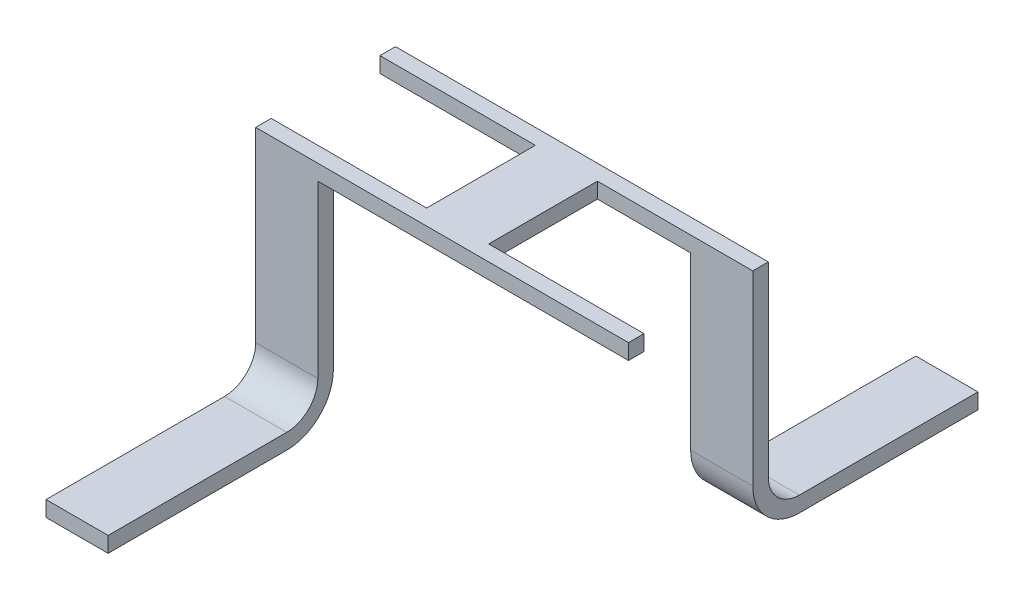
ISO-10303-21;
HEADER;
FILE_DESCRIPTION(('STEP AP214'),'2;1');
FILE_NAME('part.step','',(''),(''),'','','');
FILE_SCHEMA(('AUTOMOTIVE_DESIGN { 1 0 10303 214 1 1 1 1 }'));
ENDSEC;
DATA;
#1=APPLICATION_CONTEXT('core data for automotive mechanical design processes');
#2=APPLICATION_PROTOCOL_DEFINITION('international standard','automotive_design',2000,#1);
#3=PRODUCT_CONTEXT('',#1,'mechanical');
#4=PRODUCT('Part','Part','',(#3));
#5=PRODUCT_RELATED_PRODUCT_CATEGORY('part','',(#4));
#6=PRODUCT_DEFINITION_FORMATION('','',#4);
#7=PRODUCT_DEFINITION_CONTEXT('part definition',#1,'design');
#8=PRODUCT_DEFINITION('design','',#6,#7);
#9=PRODUCT_DEFINITION_SHAPE('','',#8);
#10=(LENGTH_UNIT() NAMED_UNIT(*) SI_UNIT(.MILLI.,.METRE.));
#11=(NAMED_UNIT(*) PLANE_ANGLE_UNIT() SI_UNIT($,.RADIAN.));
#12=(NAMED_UNIT(*) SI_UNIT($,.STERADIAN.) SOLID_ANGLE_UNIT());
#13=UNCERTAINTY_MEASURE_WITH_UNIT(LENGTH_MEASURE(1.E-05),#10,'distance_accuracy_value','');
#14=(GEOMETRIC_REPRESENTATION_CONTEXT(3) GLOBAL_UNCERTAINTY_ASSIGNED_CONTEXT((#13)) GLOBAL_UNIT_ASSIGNED_CONTEXT((#10,
#11,#12)) REPRESENTATION_CONTEXT('',''));
#15=CARTESIAN_POINT('',(0.,0.,0.));
#16=DIRECTION('',(0.,0.,1.));
#17=DIRECTION('',(1.,0.,0.));
#18=AXIS2_PLACEMENT_3D('',#15,#16,#17);
#19=CARTESIAN_POINT('',(1.524,1.778,-0.4445));
#20=DIRECTION('',(0.,0.,-1.));
#21=DIRECTION('',(-1.,0.,0.));
#22=AXIS2_PLACEMENT_3D('',#19,#20,#21);
#23=PLANE('',#22);
#24=DIRECTION('',(0.,-1.,0.));
#25=VECTOR('',#24,1.);
#26=CARTESIAN_POINT('',(-1.524,1.778,-0.4445));
#27=LINE('',#26,#25);
#28=CARTESIAN_POINT('',(-1.524,1.905,-0.4445));
#29=VERTEX_POINT('',#28);
#30=CARTESIAN_POINT('',(-1.524,1.778,-0.4445));
#31=VERTEX_POINT('',#30);
#32=EDGE_CURVE('E11',#29,#31,#27,.T.);
#33=ORIENTED_EDGE('',*,*,#32,.T.);
#34=DIRECTION('',(1.,0.,0.));
#35=VECTOR('',#34,1.);
#36=CARTESIAN_POINT('',(1.524,1.778,-0.4445));
#37=LINE('',#36,#35);
#38=CARTESIAN_POINT('',(-0.254,1.778,-0.4445));
#39=VERTEX_POINT('',#38);
#40=EDGE_CURVE('E25',#31,#39,#37,.T.);
#41=ORIENTED_EDGE('',*,*,#40,.T.);
#42=DIRECTION('',(0.,1.,0.));
#43=VECTOR('',#42,1.);
#44=CARTESIAN_POINT('',(-0.254,0.,-0.4445));
#45=LINE('',#44,#43);
#46=CARTESIAN_POINT('',(-0.254,1.905,-0.4445));
#47=VERTEX_POINT('',#46);
#48=EDGE_CURVE('E508',#39,#47,#45,.T.);
#49=ORIENTED_EDGE('',*,*,#48,.T.);
#50=DIRECTION('',(-1.,0.,0.));
#51=VECTOR('',#50,1.);
#52=CARTESIAN_POINT('',(1.524,1.905,-0.4445));
#53=LINE('',#52,#51);
#54=EDGE_CURVE('E504',#47,#29,#53,.T.);
#55=ORIENTED_EDGE('',*,*,#54,.T.);
#56=EDGE_LOOP('',(#33,#41,#49,#55));
#57=FACE_BOUND('',#56,.T.);
#58=ADVANCED_FACE('F17',(#57),#23,.F.);
#59=CARTESIAN_POINT('',(1.524,1.905,-0.5715));
#60=DIRECTION('',(0.,-1.,0.));
#61=DIRECTION('',(0.,0.,-1.));
#62=AXIS2_PLACEMENT_3D('',#59,#60,#61);
#63=PLANE('',#62);
#64=DIRECTION('',(0.,0.,1.));
#65=VECTOR('',#64,1.);
#66=CARTESIAN_POINT('',(1.524,1.905,-0.5715));
#67=LINE('',#66,#65);
#68=CARTESIAN_POINT('',(1.524,1.905,0.4445));
#69=VERTEX_POINT('',#68);
#70=CARTESIAN_POINT('',(1.524,1.905,0.5715));
#71=VERTEX_POINT('',#70);
#72=EDGE_CURVE('E499',#69,#71,#67,.T.);
#73=ORIENTED_EDGE('',*,*,#72,.F.);
#74=DIRECTION('',(-1.,0.,0.));
#75=VECTOR('',#74,1.);
#76=CARTESIAN_POINT('',(1.524,1.905,0.4445));
#77=LINE('',#76,#75);
#78=CARTESIAN_POINT('',(0.254,1.905,0.4445));
#79=VERTEX_POINT('',#78);
#80=EDGE_CURVE('E495',#69,#79,#77,.T.);
#81=ORIENTED_EDGE('',*,*,#80,.T.);
#82=DIRECTION('',(0.,0.,-1.));
#83=VECTOR('',#82,1.);
#84=CARTESIAN_POINT('',(0.254,1.905,0.4445));
#85=LINE('',#84,#83);
#86=CARTESIAN_POINT('',(0.254,1.905,-0.4445));
#87=VERTEX_POINT('',#86);
#88=EDGE_CURVE('E491',#79,#87,#85,.T.);
#89=ORIENTED_EDGE('',*,*,#88,.T.);
#90=DIRECTION('',(-1.,0.,0.));
#91=VECTOR('',#90,1.);
#92=CARTESIAN_POINT('',(1.524,1.905,-0.4445));
#93=LINE('',#92,#91);
#94=CARTESIAN_POINT('',(1.524,1.905,-0.4445));
#95=VERTEX_POINT('',#94);
#96=EDGE_CURVE('E486',#95,#87,#93,.T.);
#97=ORIENTED_EDGE('',*,*,#96,.F.);
#98=DIRECTION('',(0.,0.,1.));
#99=VECTOR('',#98,1.);
#100=CARTESIAN_POINT('',(1.524,1.905,-0.5715));
#101=LINE('',#100,#99);
#102=CARTESIAN_POINT('',(1.524,1.905,-0.5715));
#103=VERTEX_POINT('',#102);
#104=EDGE_CURVE('E481',#103,#95,#101,.T.);
#105=ORIENTED_EDGE('',*,*,#104,.F.);
#106=DIRECTION('',(-1.,0.,0.));
#107=VECTOR('',#106,1.);
#108=CARTESIAN_POINT('',(1.524,1.905,-0.5715));
#109=LINE('',#108,#107);
#110=CARTESIAN_POINT('',(-1.524,1.905,-0.5715));
#111=VERTEX_POINT('',#110);
#112=EDGE_CURVE('E477',#103,#111,#109,.T.);
#113=ORIENTED_EDGE('',*,*,#112,.T.);
#114=DIRECTION('',(0.,0.,1.));
#115=VECTOR('',#114,1.);
#116=CARTESIAN_POINT('',(-1.524,1.905,-0.5715));
#117=LINE('',#116,#115);
#118=EDGE_CURVE('E472',#111,#29,#117,.T.);
#119=ORIENTED_EDGE('',*,*,#118,.T.);
#120=ORIENTED_EDGE('',*,*,#54,.F.);
#121=DIRECTION('',(0.,0.,-1.));
#122=VECTOR('',#121,1.);
#123=CARTESIAN_POINT('',(-0.254,1.905,0.4445));
#124=LINE('',#123,#122);
#125=CARTESIAN_POINT('',(-0.254,1.905,0.4445));
#126=VERTEX_POINT('',#125);
#127=EDGE_CURVE('E467',#126,#47,#124,.T.);
#128=ORIENTED_EDGE('',*,*,#127,.F.);
#129=DIRECTION('',(-1.,0.,0.));
#130=VECTOR('',#129,1.);
#131=CARTESIAN_POINT('',(1.524,1.905,0.4445));
#132=LINE('',#131,#130);
#133=CARTESIAN_POINT('',(-1.524,1.905,0.4445));
#134=VERTEX_POINT('',#133);
#135=EDGE_CURVE('E463',#126,#134,#132,.T.);
#136=ORIENTED_EDGE('',*,*,#135,.T.);
#137=DIRECTION('',(0.,0.,1.));
#138=VECTOR('',#137,1.);
#139=CARTESIAN_POINT('',(-1.524,1.905,-0.5715));
#140=LINE('',#139,#138);
#141=CARTESIAN_POINT('',(-1.524,1.905,0.5715));
#142=VERTEX_POINT('',#141);
#143=EDGE_CURVE('E459',#134,#142,#140,.T.);
#144=ORIENTED_EDGE('',*,*,#143,.T.);
#145=DIRECTION('',(-1.,0.,0.));
#146=VECTOR('',#145,1.);
#147=CARTESIAN_POINT('',(1.524,1.905,0.5715));
#148=LINE('',#147,#146);
#149=EDGE_CURVE('E454',#71,#142,#148,.T.);
#150=ORIENTED_EDGE('',*,*,#149,.F.);
#151=EDGE_LOOP('',(#73,#81,#89,#97,#105,#113,#119,#120,#128,#136,#144,#150));
#152=FACE_BOUND('',#151,.T.);
#153=ADVANCED_FACE('F522',(#152),#63,.F.);
#154=CARTESIAN_POINT('',(1.524,1.905,0.5715));
#155=DIRECTION('',(0.,0.,-1.));
#156=DIRECTION('',(-1.,0.,0.));
#157=AXIS2_PLACEMENT_3D('',#154,#155,#156);
#158=PLANE('',#157);
#159=DIRECTION('',(0.,-1.,0.));
#160=VECTOR('',#159,1.);
#161=CARTESIAN_POINT('',(-1.016,1.905,0.5715));
#162=LINE('',#161,#160);
#163=CARTESIAN_POINT('',(-1.016,1.778,0.5715));
#164=VERTEX_POINT('',#163);
#165=CARTESIAN_POINT('',(-1.016,0.38100000000001,0.5715));
#166=VERTEX_POINT('',#165);
#167=EDGE_CURVE('E449',#164,#166,#162,.T.);
#168=ORIENTED_EDGE('',*,*,#167,.F.);
#169=DIRECTION('',(-1.,0.,0.));
#170=VECTOR('',#169,1.);
#171=CARTESIAN_POINT('',(1.524,1.778,0.5715));
#172=LINE('',#171,#170);
#173=CARTESIAN_POINT('',(1.524,1.778,0.5715));
#174=VERTEX_POINT('',#173);
#175=EDGE_CURVE('E444',#174,#164,#172,.T.);
#176=ORIENTED_EDGE('',*,*,#175,.F.);
#177=DIRECTION('',(0.,-1.,0.));
#178=VECTOR('',#177,1.);
#179=CARTESIAN_POINT('',(1.524,1.905,0.5715));
#180=LINE('',#179,#178);
#181=EDGE_CURVE('E439',#71,#174,#180,.T.);
#182=ORIENTED_EDGE('',*,*,#181,.F.);
#183=ORIENTED_EDGE('',*,*,#149,.T.);
#184=DIRECTION('',(0.,-1.,0.));
#185=VECTOR('',#184,1.);
#186=CARTESIAN_POINT('',(-1.524,1.905,0.5715));
#187=LINE('',#186,#185);
#188=CARTESIAN_POINT('',(-1.524,0.381,0.5715));
#189=VERTEX_POINT('',#188);
#190=EDGE_CURVE('E435',#142,#189,#187,.T.);
#191=ORIENTED_EDGE('',*,*,#190,.T.);
#192=DIRECTION('',(-1.,0.,0.));
#193=VECTOR('',#192,1.);
#194=CARTESIAN_POINT('',(1.524,0.381,0.5715));
#195=LINE('',#194,#193);
#196=EDGE_CURVE('E430',#166,#189,#195,.T.);
#197=ORIENTED_EDGE('',*,*,#196,.F.);
#198=EDGE_LOOP('',(#168,#176,#182,#183,#191,#197));
#199=FACE_BOUND('',#198,.T.);
#200=ADVANCED_FACE('F541',(#199),#158,.F.);
#201=CARTESIAN_POINT('',(1.524,0.38100000000001,0.82550000000001));
#202=DIRECTION('',(-1.,0.,0.));
#203=DIRECTION('',(0.,0.707106781186534,0.707106781186561));
#204=AXIS2_PLACEMENT_3D('',#201,#202,#203);
#205=CYLINDRICAL_SURFACE('',#204,0.25400000000001);
#206=DIRECTION('',(-1.,0.,0.));
#207=VECTOR('',#206,1.);
#208=CARTESIAN_POINT('',(1.524,0.127,0.8255));
#209=LINE('',#208,#207);
#210=CARTESIAN_POINT('',(-1.016,0.127,0.8255));
#211=VERTEX_POINT('',#210);
#212=CARTESIAN_POINT('',(-1.524,0.127,0.8255));
#213=VERTEX_POINT('',#212);
#214=EDGE_CURVE('E425',#211,#213,#209,.T.);
#215=ORIENTED_EDGE('',*,*,#214,.F.);
#216=CARTESIAN_POINT('',(-1.016,0.38100000000001,0.82550000000001));
#217=DIRECTION('',(1.,0.,0.));
#218=DIRECTION('',(0.,0.,-1.));
#219=AXIS2_PLACEMENT_3D('',#216,#217,#218);
#220=CIRCLE('',#219,0.25400000000001);
#221=EDGE_CURVE('E420',#211,#166,#220,.T.);
#222=ORIENTED_EDGE('',*,*,#221,.T.);
#223=ORIENTED_EDGE('',*,*,#196,.T.);
#224=CARTESIAN_POINT('',(-1.524,0.38100000000001,0.82550000000001));
#225=DIRECTION('',(1.,0.,0.));
#226=DIRECTION('',(0.,0.,-1.));
#227=AXIS2_PLACEMENT_3D('',#224,#225,#226);
#228=CIRCLE('',#227,0.25400000000001);
#229=EDGE_CURVE('E415',#213,#189,#228,.T.);
#230=ORIENTED_EDGE('',*,*,#229,.F.);
#231=EDGE_LOOP('',(#215,#222,#223,#230));
#232=FACE_BOUND('',#231,.T.);
#233=ADVANCED_FACE('F593',(#232),#205,.F.);
#234=CARTESIAN_POINT('',(-1.524,0.381000000000016,0.825500000000016));
#235=DIRECTION('',(1.,0.,0.));
#236=DIRECTION('',(0.,0.,-1.));
#237=AXIS2_PLACEMENT_3D('',#234,#235,#236);
#238=PLANE('',#237);
#239=ORIENTED_EDGE('',*,*,#143,.F.);
#240=DIRECTION('',(0.,1.,0.));
#241=VECTOR('',#240,1.);
#242=CARTESIAN_POINT('',(-1.524,0.381,0.4445));
#243=LINE('',#242,#241);
#244=CARTESIAN_POINT('',(-1.524,0.381,0.4445));
#245=VERTEX_POINT('',#244);
#246=EDGE_CURVE('E410',#245,#134,#243,.T.);
#247=ORIENTED_EDGE('',*,*,#246,.F.);
#248=CARTESIAN_POINT('',(-1.524,0.381000000000016,0.825500000000016));
#249=DIRECTION('',(1.,0.,0.));
#250=DIRECTION('',(0.,0.,-1.));
#251=AXIS2_PLACEMENT_3D('',#248,#249,#250);
#252=CIRCLE('',#251,0.381000000000016);
#253=CARTESIAN_POINT('',(-1.524,0.,0.8255));
#254=VERTEX_POINT('',#253);
#255=EDGE_CURVE('E405',#254,#245,#252,.T.);
#256=ORIENTED_EDGE('',*,*,#255,.F.);
#257=DIRECTION('',(0.,0.,-1.));
#258=VECTOR('',#257,1.);
#259=CARTESIAN_POINT('',(-1.524,0.,2.286));
#260=LINE('',#259,#258);
#261=CARTESIAN_POINT('',(-1.524,0.,2.286));
#262=VERTEX_POINT('',#261);
#263=EDGE_CURVE('E400',#262,#254,#260,.T.);
#264=ORIENTED_EDGE('',*,*,#263,.F.);
#265=DIRECTION('',(0.,-1.,0.));
#266=VECTOR('',#265,1.);
#267=CARTESIAN_POINT('',(-1.524,0.127,2.286));
#268=LINE('',#267,#266);
#269=CARTESIAN_POINT('',(-1.524,0.127,2.286));
#270=VERTEX_POINT('',#269);
#271=EDGE_CURVE('E395',#270,#262,#268,.T.);
#272=ORIENTED_EDGE('',*,*,#271,.F.);
#273=DIRECTION('',(0.,0.,1.));
#274=VECTOR('',#273,1.);
#275=CARTESIAN_POINT('',(-1.524,0.127,0.8255));
#276=LINE('',#275,#274);
#277=EDGE_CURVE('E390',#213,#270,#276,.T.);
#278=ORIENTED_EDGE('',*,*,#277,.F.);
#279=ORIENTED_EDGE('',*,*,#229,.T.);
#280=ORIENTED_EDGE('',*,*,#190,.F.);
#281=EDGE_LOOP('',(#239,#247,#256,#264,#272,#278,#279,#280));
#282=FACE_BOUND('',#281,.T.);
#283=ADVANCED_FACE('F538',(#282),#238,.F.);
#284=CARTESIAN_POINT('',(1.524,0.127,0.8255));
#285=DIRECTION('',(0.,-1.,0.));
#286=DIRECTION('',(0.,0.,-1.));
#287=AXIS2_PLACEMENT_3D('',#284,#285,#286);
#288=PLANE('',#287);
#289=DIRECTION('',(0.,0.,1.));
#290=VECTOR('',#289,1.);
#291=CARTESIAN_POINT('',(-1.016,0.127,0.8255));
#292=LINE('',#291,#290);
#293=CARTESIAN_POINT('',(-1.016,0.127,2.286));
#294=VERTEX_POINT('',#293);
#295=EDGE_CURVE('E385',#211,#294,#292,.T.);
#296=ORIENTED_EDGE('',*,*,#295,.F.);
#297=ORIENTED_EDGE('',*,*,#214,.T.);
#298=ORIENTED_EDGE('',*,*,#277,.T.);
#299=DIRECTION('',(-1.,0.,0.));
#300=VECTOR('',#299,1.);
#301=CARTESIAN_POINT('',(1.524,0.127,2.286));
#302=LINE('',#301,#300);
#303=EDGE_CURVE('E380',#294,#270,#302,.T.);
#304=ORIENTED_EDGE('',*,*,#303,.F.);
#305=EDGE_LOOP('',(#296,#297,#298,#304));
#306=FACE_BOUND('',#305,.T.);
#307=ADVANCED_FACE('F601',(#306),#288,.F.);
#308=CARTESIAN_POINT('',(1.524,0.127,2.286));
#309=DIRECTION('',(0.,0.,-1.));
#310=DIRECTION('',(-1.,0.,0.));
#311=AXIS2_PLACEMENT_3D('',#308,#309,#310);
#312=PLANE('',#311);
#313=DIRECTION('',(0.,-1.,0.));
#314=VECTOR('',#313,1.);
#315=CARTESIAN_POINT('',(-1.016,0.127,2.286));
#316=LINE('',#315,#314);
#317=CARTESIAN_POINT('',(-1.016,0.,2.286));
#318=VERTEX_POINT('',#317);
#319=EDGE_CURVE('E375',#294,#318,#316,.T.);
#320=ORIENTED_EDGE('',*,*,#319,.F.);
#321=ORIENTED_EDGE('',*,*,#303,.T.);
#322=ORIENTED_EDGE('',*,*,#271,.T.);
#323=DIRECTION('',(-1.,0.,0.));
#324=VECTOR('',#323,1.);
#325=CARTESIAN_POINT('',(1.524,0.,2.286));
#326=LINE('',#325,#324);
#327=EDGE_CURVE('E370',#318,#262,#326,.T.);
#328=ORIENTED_EDGE('',*,*,#327,.F.);
#329=EDGE_LOOP('',(#320,#321,#322,#328));
#330=FACE_BOUND('',#329,.T.);
#331=ADVANCED_FACE('F604',(#330),#312,.F.);
#332=CARTESIAN_POINT('',(1.524,0.,2.286));
#333=DIRECTION('',(0.,1.,0.));
#334=DIRECTION('',(0.,0.,1.));
#335=AXIS2_PLACEMENT_3D('',#332,#333,#334);
#336=PLANE('',#335);
#337=DIRECTION('',(0.,0.,-1.));
#338=VECTOR('',#337,1.);
#339=CARTESIAN_POINT('',(-1.016,0.,2.286));
#340=LINE('',#339,#338);
#341=CARTESIAN_POINT('',(-1.016,0.,0.8255));
#342=VERTEX_POINT('',#341);
#343=EDGE_CURVE('E365',#318,#342,#340,.T.);
#344=ORIENTED_EDGE('',*,*,#343,.F.);
#345=ORIENTED_EDGE('',*,*,#327,.T.);
#346=ORIENTED_EDGE('',*,*,#263,.T.);
#347=DIRECTION('',(-1.,0.,0.));
#348=VECTOR('',#347,1.);
#349=CARTESIAN_POINT('',(1.524,0.,0.8255));
#350=LINE('',#349,#348);
#351=EDGE_CURVE('E360',#342,#254,#350,.T.);
#352=ORIENTED_EDGE('',*,*,#351,.F.);
#353=EDGE_LOOP('',(#344,#345,#346,#352));
#354=FACE_BOUND('',#353,.T.);
#355=ADVANCED_FACE('F608',(#354),#336,.F.);
#356=CARTESIAN_POINT('',(1.524,0.381000000000016,0.825500000000016));
#357=DIRECTION('',(-1.,0.,0.));
#358=DIRECTION('',(0.,0.707106781186533,0.707106781186562));
#359=AXIS2_PLACEMENT_3D('',#356,#357,#358);
#360=CYLINDRICAL_SURFACE('',#359,0.381000000000016);
#361=CARTESIAN_POINT('',(-1.016,0.381000000000016,0.825500000000016));
#362=DIRECTION('',(1.,0.,0.));
#363=DIRECTION('',(0.,0.,-1.));
#364=AXIS2_PLACEMENT_3D('',#361,#362,#363);
#365=CIRCLE('',#364,0.381000000000016);
#366=CARTESIAN_POINT('',(-1.016,0.381000000000016,0.4445));
#367=VERTEX_POINT('',#366);
#368=EDGE_CURVE('E355',#342,#367,#365,.T.);
#369=ORIENTED_EDGE('',*,*,#368,.F.);
#370=ORIENTED_EDGE('',*,*,#351,.T.);
#371=ORIENTED_EDGE('',*,*,#255,.T.);
#372=DIRECTION('',(-1.,0.,0.));
#373=VECTOR('',#372,1.);
#374=CARTESIAN_POINT('',(1.524,0.381,0.4445));
#375=LINE('',#374,#373);
#376=EDGE_CURVE('E350',#367,#245,#375,.T.);
#377=ORIENTED_EDGE('',*,*,#376,.F.);
#378=EDGE_LOOP('',(#369,#370,#371,#377));
#379=FACE_BOUND('',#378,.T.);
#380=ADVANCED_FACE('F612',(#379),#360,.T.);
#381=CARTESIAN_POINT('',(1.524,0.381,0.4445));
#382=DIRECTION('',(0.,0.,1.));
#383=DIRECTION('',(1.,0.,0.));
#384=AXIS2_PLACEMENT_3D('',#381,#382,#383);
#385=PLANE('',#384);
#386=DIRECTION('',(0.,1.,0.));
#387=VECTOR('',#386,1.);
#388=CARTESIAN_POINT('',(-1.016,0.381,0.4445));
#389=LINE('',#388,#387);
#390=CARTESIAN_POINT('',(-1.016,1.778,0.4445));
#391=VERTEX_POINT('',#390);
#392=EDGE_CURVE('E345',#367,#391,#389,.T.);
#393=ORIENTED_EDGE('',*,*,#392,.F.);
#394=ORIENTED_EDGE('',*,*,#376,.T.);
#395=ORIENTED_EDGE('',*,*,#246,.T.);
#396=ORIENTED_EDGE('',*,*,#135,.F.);
#397=DIRECTION('',(0.,1.,0.));
#398=VECTOR('',#397,1.);
#399=CARTESIAN_POINT('',(-0.254,0.,0.4445));
#400=LINE('',#399,#398);
#401=CARTESIAN_POINT('',(-0.254,1.778,0.4445));
#402=VERTEX_POINT('',#401);
#403=EDGE_CURVE('E340',#402,#126,#400,.T.);
#404=ORIENTED_EDGE('',*,*,#403,.F.);
#405=DIRECTION('',(1.,0.,0.));
#406=VECTOR('',#405,1.);
#407=CARTESIAN_POINT('',(1.524,1.778,0.4445));
#408=LINE('',#407,#406);
#409=EDGE_CURVE('E335',#391,#402,#408,.T.);
#410=ORIENTED_EDGE('',*,*,#409,.F.);
#411=EDGE_LOOP('',(#393,#394,#395,#396,#404,#410));
#412=FACE_BOUND('',#411,.T.);
#413=ADVANCED_FACE('F533',(#412),#385,.F.);
#414=CARTESIAN_POINT('',(1.524,1.778,0.4445));
#415=DIRECTION('',(0.,1.,0.));
#416=DIRECTION('',(0.,0.,1.));
#417=AXIS2_PLACEMENT_3D('',#414,#415,#416);
#418=PLANE('',#417);
#419=ORIENTED_EDGE('',*,*,#409,.T.);
#420=DIRECTION('',(0.,0.,1.));
#421=VECTOR('',#420,1.);
#422=CARTESIAN_POINT('',(-0.254,1.778,0.4445));
#423=LINE('',#422,#421);
#424=EDGE_CURVE('E330',#39,#402,#423,.T.);
#425=ORIENTED_EDGE('',*,*,#424,.F.);
#426=ORIENTED_EDGE('',*,*,#40,.F.);
#427=DIRECTION('',(0.,0.,1.));
#428=VECTOR('',#427,1.);
#429=CARTESIAN_POINT('',(-1.524,1.778,0.825500000000016));
#430=LINE('',#429,#428);
#431=CARTESIAN_POINT('',(-1.524,1.778,-0.5715));
#432=VERTEX_POINT('',#431);
#433=EDGE_CURVE('E326',#432,#31,#430,.T.);
#434=ORIENTED_EDGE('',*,*,#433,.F.);
#435=DIRECTION('',(-1.,0.,0.));
#436=VECTOR('',#435,1.);
#437=CARTESIAN_POINT('',(1.524,1.778,-0.5715));
#438=LINE('',#437,#436);
#439=CARTESIAN_POINT('',(1.016,1.778,-0.5715));
#440=VERTEX_POINT('',#439);
#441=EDGE_CURVE('E321',#440,#432,#438,.T.);
#442=ORIENTED_EDGE('',*,*,#441,.F.);
#443=DIRECTION('',(0.,0.,1.));
#444=VECTOR('',#443,1.);
#445=CARTESIAN_POINT('',(1.016,1.778,-2.54));
#446=LINE('',#445,#444);
#447=CARTESIAN_POINT('',(1.016,1.778,-0.4445));
#448=VERTEX_POINT('',#447);
#449=EDGE_CURVE('E317',#440,#448,#446,.T.);
#450=ORIENTED_EDGE('',*,*,#449,.T.);
#451=DIRECTION('',(1.,0.,0.));
#452=VECTOR('',#451,1.);
#453=CARTESIAN_POINT('',(1.524,1.778,-0.4445));
#454=LINE('',#453,#452);
#455=CARTESIAN_POINT('',(0.254,1.778,-0.4445));
#456=VERTEX_POINT('',#455);
#457=EDGE_CURVE('E312',#456,#448,#454,.T.);
#458=ORIENTED_EDGE('',*,*,#457,.F.);
#459=DIRECTION('',(0.,0.,-1.));
#460=VECTOR('',#459,1.);
#461=CARTESIAN_POINT('',(0.254,1.778,0.4445));
#462=LINE('',#461,#460);
#463=CARTESIAN_POINT('',(0.254,1.778,0.4445));
#464=VERTEX_POINT('',#463);
#465=EDGE_CURVE('E307',#464,#456,#462,.T.);
#466=ORIENTED_EDGE('',*,*,#465,.F.);
#467=DIRECTION('',(1.,0.,0.));
#468=VECTOR('',#467,1.);
#469=CARTESIAN_POINT('',(1.524,1.778,0.4445));
#470=LINE('',#469,#468);
#471=CARTESIAN_POINT('',(1.524,1.778,0.4445));
#472=VERTEX_POINT('',#471);
#473=EDGE_CURVE('E303',#464,#472,#470,.T.);
#474=ORIENTED_EDGE('',*,*,#473,.T.);
#475=DIRECTION('',(0.,0.,-1.));
#476=VECTOR('',#475,1.);
#477=CARTESIAN_POINT('',(1.524,1.778,0.825500000000016));
#478=LINE('',#477,#476);
#479=EDGE_CURVE('E298',#174,#472,#478,.T.);
#480=ORIENTED_EDGE('',*,*,#479,.F.);
#481=ORIENTED_EDGE('',*,*,#175,.T.);
#482=DIRECTION('',(0.,0.,-1.));
#483=VECTOR('',#482,1.);
#484=CARTESIAN_POINT('',(-1.016,1.778,2.54));
#485=LINE('',#484,#483);
#486=EDGE_CURVE('E293',#164,#391,#485,.T.);
#487=ORIENTED_EDGE('',*,*,#486,.T.);
#488=EDGE_LOOP('',(#419,#425,#426,#434,#442,#450,#458,#466,#474,#480,#481,#487));
#489=FACE_BOUND('',#488,.T.);
#490=ADVANCED_FACE('F529',(#489),#418,.F.);
#491=CARTESIAN_POINT('',(-1.016,1.778,2.54));
#492=DIRECTION('',(1.,0.,0.));
#493=DIRECTION('',(0.,0.,-1.));
#494=AXIS2_PLACEMENT_3D('',#491,#492,#493);
#495=PLANE('',#494);
#496=ORIENTED_EDGE('',*,*,#392,.T.);
#497=ORIENTED_EDGE('',*,*,#486,.F.);
#498=ORIENTED_EDGE('',*,*,#167,.T.);
#499=ORIENTED_EDGE('',*,*,#221,.F.);
#500=ORIENTED_EDGE('',*,*,#295,.T.);
#501=ORIENTED_EDGE('',*,*,#319,.T.);
#502=ORIENTED_EDGE('',*,*,#343,.T.);
#503=ORIENTED_EDGE('',*,*,#368,.T.);
#504=EDGE_LOOP('',(#496,#497,#498,#499,#500,#501,#502,#503));
#505=FACE_BOUND('',#504,.T.);
#506=ADVANCED_FACE('F621',(#505),#495,.T.);
#507=CARTESIAN_POINT('',(1.524,0.381000000000016,0.825500000000016));
#508=DIRECTION('',(1.,0.,0.));
#509=DIRECTION('',(0.,0.,-1.));
#510=AXIS2_PLACEMENT_3D('',#507,#508,#509);
#511=PLANE('',#510);
#512=ORIENTED_EDGE('',*,*,#181,.T.);
#513=ORIENTED_EDGE('',*,*,#479,.T.);
#514=DIRECTION('',(0.,1.,0.));
#515=VECTOR('',#514,1.);
#516=CARTESIAN_POINT('',(1.524,0.381,0.4445));
#517=LINE('',#516,#515);
#518=EDGE_CURVE('E288',#472,#69,#517,.T.);
#519=ORIENTED_EDGE('',*,*,#518,.T.);
#520=ORIENTED_EDGE('',*,*,#72,.T.);
#521=EDGE_LOOP('',(#512,#513,#519,#520));
#522=FACE_BOUND('',#521,.T.);
#523=ADVANCED_FACE('F544',(#522),#511,.T.);
#524=CARTESIAN_POINT('',(1.524,0.381,0.4445));
#525=DIRECTION('',(0.,0.,1.));
#526=DIRECTION('',(1.,0.,0.));
#527=AXIS2_PLACEMENT_3D('',#524,#525,#526);
#528=PLANE('',#527);
#529=ORIENTED_EDGE('',*,*,#473,.F.);
#530=DIRECTION('',(0.,-1.,0.));
#531=VECTOR('',#530,1.);
#532=CARTESIAN_POINT('',(0.254,1.905,0.4445));
#533=LINE('',#532,#531);
#534=EDGE_CURVE('E283',#79,#464,#533,.T.);
#535=ORIENTED_EDGE('',*,*,#534,.F.);
#536=ORIENTED_EDGE('',*,*,#80,.F.);
#537=ORIENTED_EDGE('',*,*,#518,.F.);
#538=EDGE_LOOP('',(#529,#535,#536,#537));
#539=FACE_BOUND('',#538,.T.);
#540=ADVANCED_FACE('F552',(#539),#528,.F.);
#541=CARTESIAN_POINT('',(0.254,1.905,0.4445));
#542=DIRECTION('',(1.,0.,0.));
#543=DIRECTION('',(0.,0.,-1.));
#544=AXIS2_PLACEMENT_3D('',#541,#542,#543);
#545=PLANE('',#544);
#546=ORIENTED_EDGE('',*,*,#465,.T.);
#547=DIRECTION('',(0.,-1.,0.));
#548=VECTOR('',#547,1.);
#549=CARTESIAN_POINT('',(0.254,1.905,-0.4445));
#550=LINE('',#549,#548);
#551=EDGE_CURVE('E278',#87,#456,#550,.T.);
#552=ORIENTED_EDGE('',*,*,#551,.F.);
#553=ORIENTED_EDGE('',*,*,#88,.F.);
#554=ORIENTED_EDGE('',*,*,#534,.T.);
#555=EDGE_LOOP('',(#546,#552,#553,#554));
#556=FACE_BOUND('',#555,.T.);
#557=ADVANCED_FACE('F554',(#556),#545,.T.);
#558=CARTESIAN_POINT('',(1.524,1.778,-0.4445));
#559=DIRECTION('',(0.,0.,-1.));
#560=DIRECTION('',(-1.,0.,0.));
#561=AXIS2_PLACEMENT_3D('',#558,#559,#560);
#562=PLANE('',#561);
#563=ORIENTED_EDGE('',*,*,#551,.T.);
#564=ORIENTED_EDGE('',*,*,#457,.T.);
#565=DIRECTION('',(0.,-1.,0.));
#566=VECTOR('',#565,1.);
#567=CARTESIAN_POINT('',(1.016,1.778,-0.4445));
#568=LINE('',#567,#566);
#569=CARTESIAN_POINT('',(1.016,0.381,-0.4445));
#570=VERTEX_POINT('',#569);
#571=EDGE_CURVE('E274',#448,#570,#568,.T.);
#572=ORIENTED_EDGE('',*,*,#571,.T.);
#573=DIRECTION('',(-1.,0.,0.));
#574=VECTOR('',#573,1.);
#575=CARTESIAN_POINT('',(1.524,0.381,-0.4445));
#576=LINE('',#575,#574);
#577=CARTESIAN_POINT('',(1.524,0.381,-0.4445));
#578=VERTEX_POINT('',#577);
#579=EDGE_CURVE('E199',#578,#570,#576,.T.);
#580=ORIENTED_EDGE('',*,*,#579,.F.);
#581=DIRECTION('',(0.,-1.,0.));
#582=VECTOR('',#581,1.);
#583=CARTESIAN_POINT('',(1.524,1.778,-0.4445));
#584=LINE('',#583,#582);
#585=EDGE_CURVE('E266',#95,#578,#584,.T.);
#586=ORIENTED_EDGE('',*,*,#585,.F.);
#587=ORIENTED_EDGE('',*,*,#96,.T.);
#588=EDGE_LOOP('',(#563,#564,#572,#580,#586,#587));
#589=FACE_BOUND('',#588,.T.);
#590=ADVANCED_FACE('F557',(#589),#562,.F.);
#591=CARTESIAN_POINT('',(1.524,0.381000000000016,0.825500000000016));
#592=DIRECTION('',(1.,0.,0.));
#593=DIRECTION('',(0.,0.,-1.));
#594=AXIS2_PLACEMENT_3D('',#591,#592,#593);
#595=PLANE('',#594);
#596=ORIENTED_EDGE('',*,*,#585,.T.);
#597=CARTESIAN_POINT('',(1.524,0.381000000000016,-0.825500000000016));
#598=DIRECTION('',(1.,0.,0.));
#599=DIRECTION('',(0.,0.,-1.));
#600=AXIS2_PLACEMENT_3D('',#597,#598,#599);
#601=CIRCLE('',#600,0.381000000000016);
#602=CARTESIAN_POINT('',(1.524,0.,-0.8255));
#603=VERTEX_POINT('',#602);
#604=EDGE_CURVE('E262',#578,#603,#601,.T.);
#605=ORIENTED_EDGE('',*,*,#604,.T.);
#606=DIRECTION('',(0.,0.,-1.));
#607=VECTOR('',#606,1.);
#608=CARTESIAN_POINT('',(1.524,0.,-0.8255));
#609=LINE('',#608,#607);
#610=CARTESIAN_POINT('',(1.524,0.,-2.286));
#611=VERTEX_POINT('',#610);
#612=EDGE_CURVE('E193',#603,#611,#609,.T.);
#613=ORIENTED_EDGE('',*,*,#612,.T.);
#614=DIRECTION('',(0.,1.,0.));
#615=VECTOR('',#614,1.);
#616=CARTESIAN_POINT('',(1.524,0.,-2.286));
#617=LINE('',#616,#615);
#618=CARTESIAN_POINT('',(1.524,0.127,-2.286));
#619=VERTEX_POINT('',#618);
#620=EDGE_CURVE('E255',#611,#619,#617,.T.);
#621=ORIENTED_EDGE('',*,*,#620,.T.);
#622=DIRECTION('',(0.,0.,1.));
#623=VECTOR('',#622,1.);
#624=CARTESIAN_POINT('',(1.524,0.127,-2.286));
#625=LINE('',#624,#623);
#626=CARTESIAN_POINT('',(1.524,0.127,-0.8255));
#627=VERTEX_POINT('',#626);
#628=EDGE_CURVE('E251',#619,#627,#625,.T.);
#629=ORIENTED_EDGE('',*,*,#628,.T.);
#630=CARTESIAN_POINT('',(1.524,0.38100000000001,-0.82550000000001));
#631=DIRECTION('',(1.,0.,0.));
#632=DIRECTION('',(0.,0.,-1.));
#633=AXIS2_PLACEMENT_3D('',#630,#631,#632);
#634=CIRCLE('',#633,0.25400000000001);
#635=CARTESIAN_POINT('',(1.524,0.381,-0.5715));
#636=VERTEX_POINT('',#635);
#637=EDGE_CURVE('E246',#636,#627,#634,.T.);
#638=ORIENTED_EDGE('',*,*,#637,.F.);
#639=DIRECTION('',(0.,1.,0.));
#640=VECTOR('',#639,1.);
#641=CARTESIAN_POINT('',(1.524,0.381,-0.5715));
#642=LINE('',#641,#640);
#643=EDGE_CURVE('E241',#636,#103,#642,.T.);
#644=ORIENTED_EDGE('',*,*,#643,.T.);
#645=ORIENTED_EDGE('',*,*,#104,.T.);
#646=EDGE_LOOP('',(#596,#605,#613,#621,#629,#638,#644,#645));
#647=FACE_BOUND('',#646,.T.);
#648=ADVANCED_FACE('F560',(#647),#595,.T.);
#649=CARTESIAN_POINT('',(1.524,0.381,-0.5715));
#650=DIRECTION('',(0.,0.,1.));
#651=DIRECTION('',(1.,0.,0.));
#652=AXIS2_PLACEMENT_3D('',#649,#650,#651);
#653=PLANE('',#652);
#654=DIRECTION('',(0.,1.,0.));
#655=VECTOR('',#654,1.);
#656=CARTESIAN_POINT('',(1.016,0.381,-0.5715));
#657=LINE('',#656,#655);
#658=CARTESIAN_POINT('',(1.016,0.381,-0.5715));
#659=VERTEX_POINT('',#658);
#660=EDGE_CURVE('E236',#659,#440,#657,.T.);
#661=ORIENTED_EDGE('',*,*,#660,.T.);
#662=ORIENTED_EDGE('',*,*,#441,.T.);
#663=DIRECTION('',(0.,1.,0.));
#664=VECTOR('',#663,1.);
#665=CARTESIAN_POINT('',(-1.524,0.381,-0.5715));
#666=LINE('',#665,#664);
#667=EDGE_CURVE('E231',#432,#111,#666,.T.);
#668=ORIENTED_EDGE('',*,*,#667,.T.);
#669=ORIENTED_EDGE('',*,*,#112,.F.);
#670=ORIENTED_EDGE('',*,*,#643,.F.);
#671=DIRECTION('',(-1.,0.,0.));
#672=VECTOR('',#671,1.);
#673=CARTESIAN_POINT('',(1.524,0.381,-0.5715));
#674=LINE('',#673,#672);
#675=EDGE_CURVE('E227',#636,#659,#674,.T.);
#676=ORIENTED_EDGE('',*,*,#675,.T.);
#677=EDGE_LOOP('',(#661,#662,#668,#669,#670,#676));
#678=FACE_BOUND('',#677,.T.);
#679=ADVANCED_FACE('F563',(#678),#653,.F.);
#680=CARTESIAN_POINT('',(1.524,0.38100000000001,-0.82550000000001));
#681=DIRECTION('',(-1.,0.,0.));
#682=DIRECTION('',(0.,0.707106781186548,-0.707106781186547));
#683=AXIS2_PLACEMENT_3D('',#680,#681,#682);
#684=CYLINDRICAL_SURFACE('',#683,0.25400000000001);
#685=CARTESIAN_POINT('',(1.016,0.38100000000001,-0.82550000000001));
#686=DIRECTION('',(1.,0.,0.));
#687=DIRECTION('',(0.,0.,-1.));
#688=AXIS2_PLACEMENT_3D('',#685,#686,#687);
#689=CIRCLE('',#688,0.25400000000001);
#690=CARTESIAN_POINT('',(1.016,0.127,-0.8255));
#691=VERTEX_POINT('',#690);
#692=EDGE_CURVE('E222',#659,#691,#689,.T.);
#693=ORIENTED_EDGE('',*,*,#692,.F.);
#694=ORIENTED_EDGE('',*,*,#675,.F.);
#695=ORIENTED_EDGE('',*,*,#637,.T.);
#696=DIRECTION('',(-1.,0.,0.));
#697=VECTOR('',#696,1.);
#698=CARTESIAN_POINT('',(1.524,0.127,-0.8255));
#699=LINE('',#698,#697);
#700=EDGE_CURVE('E218',#627,#691,#699,.T.);
#701=ORIENTED_EDGE('',*,*,#700,.T.);
#702=EDGE_LOOP('',(#693,#694,#695,#701));
#703=FACE_BOUND('',#702,.T.);
#704=ADVANCED_FACE('F576',(#703),#684,.F.);
#705=CARTESIAN_POINT('',(1.524,0.127,-2.286));
#706=DIRECTION('',(0.,-1.,0.));
#707=DIRECTION('',(0.,0.,-1.));
#708=AXIS2_PLACEMENT_3D('',#705,#706,#707);
#709=PLANE('',#708);
#710=DIRECTION('',(-1.,0.,0.));
#711=VECTOR('',#710,1.);
#712=CARTESIAN_POINT('',(1.524,0.127,-2.286));
#713=LINE('',#712,#711);
#714=CARTESIAN_POINT('',(1.016,0.127,-2.286));
#715=VERTEX_POINT('',#714);
#716=EDGE_CURVE('E214',#619,#715,#713,.T.);
#717=ORIENTED_EDGE('',*,*,#716,.T.);
#718=DIRECTION('',(0.,0.,1.));
#719=VECTOR('',#718,1.);
#720=CARTESIAN_POINT('',(1.016,0.127,-2.286));
#721=LINE('',#720,#719);
#722=EDGE_CURVE('E209',#715,#691,#721,.T.);
#723=ORIENTED_EDGE('',*,*,#722,.T.);
#724=ORIENTED_EDGE('',*,*,#700,.F.);
#725=ORIENTED_EDGE('',*,*,#628,.F.);
#726=EDGE_LOOP('',(#717,#723,#724,#725));
#727=FACE_BOUND('',#726,.T.);
#728=ADVANCED_FACE('F573',(#727),#709,.F.);
#729=CARTESIAN_POINT('',(1.016,0.,-2.54));
#730=DIRECTION('',(1.,0.,0.));
#731=DIRECTION('',(0.,0.,-1.));
#732=AXIS2_PLACEMENT_3D('',#729,#730,#731);
#733=PLANE('',#732);
#734=ORIENTED_EDGE('',*,*,#449,.F.);
#735=ORIENTED_EDGE('',*,*,#660,.F.);
#736=ORIENTED_EDGE('',*,*,#692,.T.);
#737=ORIENTED_EDGE('',*,*,#722,.F.);
#738=DIRECTION('',(0.,1.,0.));
#739=VECTOR('',#738,1.);
#740=CARTESIAN_POINT('',(1.016,0.,-2.286));
#741=LINE('',#740,#739);
#742=CARTESIAN_POINT('',(1.016,0.,-2.286));
#743=VERTEX_POINT('',#742);
#744=EDGE_CURVE('E184',#743,#715,#741,.T.);
#745=ORIENTED_EDGE('',*,*,#744,.F.);
#746=DIRECTION('',(0.,0.,1.));
#747=VECTOR('',#746,1.);
#748=CARTESIAN_POINT('',(1.016,0.,-2.54));
#749=LINE('',#748,#747);
#750=CARTESIAN_POINT('',(1.016,0.,-0.8255));
#751=VERTEX_POINT('',#750);
#752=EDGE_CURVE('E174',#743,#751,#749,.T.);
#753=ORIENTED_EDGE('',*,*,#752,.T.);
#754=CARTESIAN_POINT('',(1.016,0.381000000000016,-0.825500000000016));
#755=DIRECTION('',(1.,0.,0.));
#756=DIRECTION('',(0.,0.,-1.));
#757=AXIS2_PLACEMENT_3D('',#754,#755,#756);
#758=CIRCLE('',#757,0.381000000000016);
#759=EDGE_CURVE('E180',#570,#751,#758,.T.);
#760=ORIENTED_EDGE('',*,*,#759,.F.);
#761=ORIENTED_EDGE('',*,*,#571,.F.);
#762=EDGE_LOOP('',(#734,#735,#736,#737,#745,#753,#760,#761));
#763=FACE_BOUND('',#762,.T.);
#764=ADVANCED_FACE('F177',(#763),#733,.F.);
#765=CARTESIAN_POINT('',(1.524,0.381000000000016,-0.825500000000016));
#766=DIRECTION('',(-1.,0.,0.));
#767=DIRECTION('',(0.,0.707106781186548,-0.707106781186547));
#768=AXIS2_PLACEMENT_3D('',#765,#766,#767);
#769=CYLINDRICAL_SURFACE('',#768,0.381000000000016);
#770=ORIENTED_EDGE('',*,*,#579,.T.);
#771=ORIENTED_EDGE('',*,*,#759,.T.);
#772=DIRECTION('',(-1.,0.,0.));
#773=VECTOR('',#772,1.);
#774=CARTESIAN_POINT('',(1.524,0.,-0.8255));
#775=LINE('',#774,#773);
#776=EDGE_CURVE('E191',#603,#751,#775,.T.);
#777=ORIENTED_EDGE('',*,*,#776,.F.);
#778=ORIENTED_EDGE('',*,*,#604,.F.);
#779=EDGE_LOOP('',(#770,#771,#777,#778));
#780=FACE_BOUND('',#779,.T.);
#781=ADVANCED_FACE('F198',(#780),#769,.T.);
#782=CARTESIAN_POINT('',(1.524,0.,-0.8255));
#783=DIRECTION('',(0.,1.,0.));
#784=DIRECTION('',(0.,0.,1.));
#785=AXIS2_PLACEMENT_3D('',#782,#783,#784);
#786=PLANE('',#785);
#787=ORIENTED_EDGE('',*,*,#776,.T.);
#788=ORIENTED_EDGE('',*,*,#752,.F.);
#789=DIRECTION('',(-1.,0.,0.));
#790=VECTOR('',#789,1.);
#791=CARTESIAN_POINT('',(1.524,0.,-2.286));
#792=LINE('',#791,#790);
#793=EDGE_CURVE('E196',#611,#743,#792,.T.);
#794=ORIENTED_EDGE('',*,*,#793,.F.);
#795=ORIENTED_EDGE('',*,*,#612,.F.);
#796=EDGE_LOOP('',(#787,#788,#794,#795));
#797=FACE_BOUND('',#796,.T.);
#798=ADVANCED_FACE('F192',(#797),#786,.F.);
#799=CARTESIAN_POINT('',(1.524,0.,-2.286));
#800=DIRECTION('',(0.,0.,1.));
#801=DIRECTION('',(1.,0.,0.));
#802=AXIS2_PLACEMENT_3D('',#799,#800,#801);
#803=PLANE('',#802);
#804=ORIENTED_EDGE('',*,*,#793,.T.);
#805=ORIENTED_EDGE('',*,*,#744,.T.);
#806=ORIENTED_EDGE('',*,*,#716,.F.);
#807=ORIENTED_EDGE('',*,*,#620,.F.);
#808=EDGE_LOOP('',(#804,#805,#806,#807));
#809=FACE_BOUND('',#808,.T.);
#810=ADVANCED_FACE('F569',(#809),#803,.F.);
#811=CARTESIAN_POINT('',(-1.524,0.381000000000016,0.825500000000016));
#812=DIRECTION('',(1.,0.,0.));
#813=DIRECTION('',(0.,0.,-1.));
#814=AXIS2_PLACEMENT_3D('',#811,#812,#813);
#815=PLANE('',#814);
#816=ORIENTED_EDGE('',*,*,#667,.F.);
#817=ORIENTED_EDGE('',*,*,#433,.T.);
#818=ORIENTED_EDGE('',*,*,#32,.F.);
#819=ORIENTED_EDGE('',*,*,#118,.F.);
#820=EDGE_LOOP('',(#816,#817,#818,#819));
#821=FACE_BOUND('',#820,.T.);
#822=ADVANCED_FACE('F527',(#821),#815,.F.);
#823=CARTESIAN_POINT('',(-0.254,0.,0.4445));
#824=DIRECTION('',(-1.,0.,0.));
#825=DIRECTION('',(0.,0.,1.));
#826=AXIS2_PLACEMENT_3D('',#823,#824,#825);
#827=PLANE('',#826);
#828=ORIENTED_EDGE('',*,*,#424,.T.);
#829=ORIENTED_EDGE('',*,*,#403,.T.);
#830=ORIENTED_EDGE('',*,*,#127,.T.);
#831=ORIENTED_EDGE('',*,*,#48,.F.);
#832=EDGE_LOOP('',(#828,#829,#830,#831));
#833=FACE_BOUND('',#832,.T.);
#834=ADVANCED_FACE('F519',(#833),#827,.T.);
#835=CLOSED_SHELL('',(#58,#153,#200,#233,#283,#307,#331,#355,#380,#413,#490,#506,#523,#540,#557,
#590,#648,#679,#704,#728,#764,#781,#798,#810,#822,#834));
#836=MANIFOLD_SOLID_BREP('B1',#835);
#837=ADVANCED_BREP_SHAPE_REPRESENTATION('',(#18,#836),#14);
#838=SHAPE_DEFINITION_REPRESENTATION(#9,#837);
ENDSEC;
END-ISO-10303-21;
